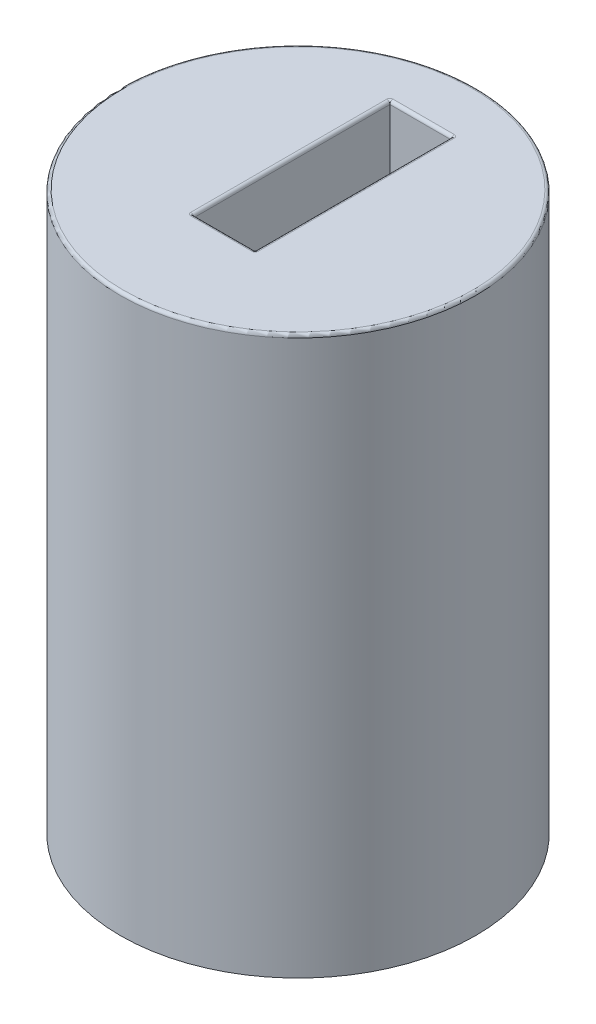
ISO-10303-21;
HEADER;
FILE_DESCRIPTION(('STEP AP214'),'2;1');
FILE_NAME('part.step','',(''),(''),'','','');
FILE_SCHEMA(('AUTOMOTIVE_DESIGN { 1 0 10303 214 1 1 1 1 }'));
ENDSEC;
DATA;
#1=APPLICATION_CONTEXT('core data for automotive mechanical design processes');
#2=APPLICATION_PROTOCOL_DEFINITION('international standard','automotive_design',2000,#1);
#3=PRODUCT_CONTEXT('',#1,'mechanical');
#4=PRODUCT('Part','Part','',(#3));
#5=PRODUCT_RELATED_PRODUCT_CATEGORY('part','',(#4));
#6=PRODUCT_DEFINITION_FORMATION('','',#4);
#7=PRODUCT_DEFINITION_CONTEXT('part definition',#1,'design');
#8=PRODUCT_DEFINITION('design','',#6,#7);
#9=PRODUCT_DEFINITION_SHAPE('','',#8);
#10=(LENGTH_UNIT() NAMED_UNIT(*) SI_UNIT(.MILLI.,.METRE.));
#11=(NAMED_UNIT(*) PLANE_ANGLE_UNIT() SI_UNIT($,.RADIAN.));
#12=(NAMED_UNIT(*) SI_UNIT($,.STERADIAN.) SOLID_ANGLE_UNIT());
#13=UNCERTAINTY_MEASURE_WITH_UNIT(LENGTH_MEASURE(1.E-05),#10,'distance_accuracy_value','');
#14=(GEOMETRIC_REPRESENTATION_CONTEXT(3) GLOBAL_UNCERTAINTY_ASSIGNED_CONTEXT((#13)) GLOBAL_UNIT_ASSIGNED_CONTEXT((#10,
#11,#12)) REPRESENTATION_CONTEXT('',''));
#15=CARTESIAN_POINT('',(0.,0.,0.));
#16=DIRECTION('',(0.,0.,1.));
#17=DIRECTION('',(1.,0.,0.));
#18=AXIS2_PLACEMENT_3D('',#15,#16,#17);
#19=CARTESIAN_POINT('',(0.,34.64,0.));
#20=DIRECTION('',(0.,-1.,0.));
#21=DIRECTION('',(0.,0.,-1.));
#22=AXIS2_PLACEMENT_3D('',#19,#20,#21);
#23=CYLINDRICAL_SURFACE('',#22,7.25);
#24=CARTESIAN_POINT('',(0.,34.513,0.));
#25=DIRECTION('',(0.,1.,0.));
#26=DIRECTION('',(0.,0.,1.));
#27=AXIS2_PLACEMENT_3D('',#24,#25,#26);
#28=CIRCLE('',#27,7.25);
#29=CARTESIAN_POINT('',(0.,34.513,7.25));
#30=VERTEX_POINT('',#29);
#31=EDGE_CURVE('E131',#30,#30,#28,.F.);
#32=ORIENTED_EDGE('',*,*,#31,.T.);
#33=EDGE_LOOP('',(#32));
#34=FACE_BOUND('',#33,.T.);
#35=CARTESIAN_POINT('',(0.,11.9,0.));
#36=DIRECTION('',(0.,-1.,0.));
#37=DIRECTION('',(0.,0.,1.));
#38=AXIS2_PLACEMENT_3D('',#35,#36,#37);
#39=CIRCLE('',#38,7.25);
#40=CARTESIAN_POINT('',(0.,11.9,7.25));
#41=VERTEX_POINT('',#40);
#42=EDGE_CURVE('E126',#41,#41,#39,.T.);
#43=ORIENTED_EDGE('',*,*,#42,.F.);
#44=EDGE_LOOP('',(#43));
#45=FACE_BOUND('',#44,.T.);
#46=ADVANCED_FACE('F35',(#34,#45),#23,.T.);
#47=CARTESIAN_POINT('',(0.,34.64,0.));
#48=DIRECTION('',(0.,1.,0.));
#49=DIRECTION('',(0.,0.,1.));
#50=AXIS2_PLACEMENT_3D('',#47,#48,#49);
#51=PLANE('',#50);
#52=CARTESIAN_POINT('',(0.,34.64,0.));
#53=DIRECTION('',(0.,1.,0.));
#54=DIRECTION('',(0.,0.,1.));
#55=AXIS2_PLACEMENT_3D('',#52,#53,#54);
#56=CIRCLE('',#55,7.123);
#57=CARTESIAN_POINT('',(0.,34.64,7.123));
#58=VERTEX_POINT('',#57);
#59=EDGE_CURVE('E155',#58,#58,#56,.T.);
#60=ORIENTED_EDGE('',*,*,#59,.T.);
#61=EDGE_LOOP('',(#60));
#62=FACE_BOUND('',#61,.T.);
#63=CARTESIAN_POINT('',(1.25,34.64,3.));
#64=DIRECTION('',(0.,1.,0.));
#65=DIRECTION('',(0.,0.,1.));
#66=AXIS2_PLACEMENT_3D('',#63,#64,#65);
#67=CIRCLE('',#66,0.127);
#68=CARTESIAN_POINT('',(1.25,34.64,3.127));
#69=VERTEX_POINT('',#68);
#70=CARTESIAN_POINT('',(1.377,34.64,3.));
#71=VERTEX_POINT('',#70);
#72=EDGE_CURVE('E147',#69,#71,#67,.T.);
#73=ORIENTED_EDGE('',*,*,#72,.F.);
#74=DIRECTION('',(-1.,0.,0.));
#75=VECTOR('',#74,1.);
#76=CARTESIAN_POINT('',(-1.25,34.64,3.127));
#77=LINE('',#76,#75);
#78=CARTESIAN_POINT('',(-1.25,34.64,3.127));
#79=VERTEX_POINT('',#78);
#80=EDGE_CURVE('E153',#69,#79,#77,.T.);
#81=ORIENTED_EDGE('',*,*,#80,.T.);
#82=CARTESIAN_POINT('',(-1.25,34.64,3.));
#83=DIRECTION('',(0.,1.,0.));
#84=DIRECTION('',(0.,0.,1.));
#85=AXIS2_PLACEMENT_3D('',#82,#83,#84);
#86=CIRCLE('',#85,0.127);
#87=CARTESIAN_POINT('',(-1.377,34.64,3.));
#88=VERTEX_POINT('',#87);
#89=EDGE_CURVE('E150',#88,#79,#86,.T.);
#90=ORIENTED_EDGE('',*,*,#89,.F.);
#91=DIRECTION('',(0.,0.,-1.));
#92=VECTOR('',#91,1.);
#93=CARTESIAN_POINT('',(-1.377,34.64,-5.));
#94=LINE('',#93,#92);
#95=CARTESIAN_POINT('',(-1.377,34.64,-5.));
#96=VERTEX_POINT('',#95);
#97=EDGE_CURVE('E144',#88,#96,#94,.T.);
#98=ORIENTED_EDGE('',*,*,#97,.T.);
#99=CARTESIAN_POINT('',(-1.25,34.64,-5.));
#100=DIRECTION('',(0.,1.,0.));
#101=DIRECTION('',(0.,0.,1.));
#102=AXIS2_PLACEMENT_3D('',#99,#100,#101);
#103=CIRCLE('',#102,0.127);
#104=CARTESIAN_POINT('',(-1.25,34.64,-5.127));
#105=VERTEX_POINT('',#104);
#106=EDGE_CURVE('E141',#105,#96,#103,.T.);
#107=ORIENTED_EDGE('',*,*,#106,.F.);
#108=DIRECTION('',(1.,0.,0.));
#109=VECTOR('',#108,1.);
#110=CARTESIAN_POINT('',(1.25,34.64,-5.127));
#111=LINE('',#110,#109);
#112=CARTESIAN_POINT('',(1.25,34.64,-5.127));
#113=VERTEX_POINT('',#112);
#114=EDGE_CURVE('E137',#105,#113,#111,.T.);
#115=ORIENTED_EDGE('',*,*,#114,.T.);
#116=CARTESIAN_POINT('',(1.25,34.64,-5.));
#117=DIRECTION('',(0.,1.,0.));
#118=DIRECTION('',(0.,0.,1.));
#119=AXIS2_PLACEMENT_3D('',#116,#117,#118);
#120=CIRCLE('',#119,0.127);
#121=CARTESIAN_POINT('',(1.377,34.64,-5.));
#122=VERTEX_POINT('',#121);
#123=EDGE_CURVE('E134',#122,#113,#120,.T.);
#124=ORIENTED_EDGE('',*,*,#123,.F.);
#125=DIRECTION('',(0.,0.,1.));
#126=VECTOR('',#125,1.);
#127=CARTESIAN_POINT('',(1.377,34.64,3.));
#128=LINE('',#127,#126);
#129=EDGE_CURVE('E139',#122,#71,#128,.T.);
#130=ORIENTED_EDGE('',*,*,#129,.T.);
#131=EDGE_LOOP('',(#73,#81,#90,#98,#107,#115,#124,#130));
#132=FACE_BOUND('',#131,.T.);
#133=ADVANCED_FACE('F204',(#62,#132),#51,.T.);
#134=CARTESIAN_POINT('',(0.,11.9,0.));
#135=DIRECTION('',(0.,1.,0.));
#136=DIRECTION('',(0.,0.,1.));
#137=AXIS2_PLACEMENT_3D('',#134,#135,#136);
#138=PLANE('',#137);
#139=DIRECTION('',(0.,0.,1.));
#140=VECTOR('',#139,1.);
#141=CARTESIAN_POINT('',(1.25,11.9,3.));
#142=LINE('',#141,#140);
#143=CARTESIAN_POINT('',(1.25,11.9,-5.));
#144=VERTEX_POINT('',#143);
#145=CARTESIAN_POINT('',(1.25,11.9,3.));
#146=VERTEX_POINT('',#145);
#147=EDGE_CURVE('E109',#144,#146,#142,.T.);
#148=ORIENTED_EDGE('',*,*,#147,.F.);
#149=DIRECTION('',(1.,0.,0.));
#150=VECTOR('',#149,1.);
#151=CARTESIAN_POINT('',(1.25,11.9,-5.));
#152=LINE('',#151,#150);
#153=CARTESIAN_POINT('',(-1.25,11.9,-5.));
#154=VERTEX_POINT('',#153);
#155=EDGE_CURVE('E114',#154,#144,#152,.T.);
#156=ORIENTED_EDGE('',*,*,#155,.F.);
#157=DIRECTION('',(0.,0.,-1.));
#158=VECTOR('',#157,1.);
#159=CARTESIAN_POINT('',(-1.25,11.9,-5.));
#160=LINE('',#159,#158);
#161=CARTESIAN_POINT('',(-1.25,11.9,3.));
#162=VERTEX_POINT('',#161);
#163=EDGE_CURVE('E119',#162,#154,#160,.T.);
#164=ORIENTED_EDGE('',*,*,#163,.F.);
#165=DIRECTION('',(-1.,0.,0.));
#166=VECTOR('',#165,1.);
#167=CARTESIAN_POINT('',(-1.25,11.9,3.));
#168=LINE('',#167,#166);
#169=EDGE_CURVE('E103',#146,#162,#168,.T.);
#170=ORIENTED_EDGE('',*,*,#169,.F.);
#171=EDGE_LOOP('',(#148,#156,#164,#170));
#172=FACE_BOUND('',#171,.T.);
#173=ORIENTED_EDGE('',*,*,#42,.T.);
#174=EDGE_LOOP('',(#173));
#175=FACE_BOUND('',#174,.T.);
#176=ADVANCED_FACE('F116',(#172,#175),#138,.F.);
#177=CARTESIAN_POINT('',(1.25,34.64,-5.));
#178=DIRECTION('',(0.,0.,-1.));
#179=DIRECTION('',(-1.,0.,0.));
#180=AXIS2_PLACEMENT_3D('',#177,#178,#179);
#181=PLANE('',#180);
#182=DIRECTION('',(0.,-1.,0.));
#183=VECTOR('',#182,1.);
#184=CARTESIAN_POINT('',(1.25,34.64,-5.));
#185=LINE('',#184,#183);
#186=CARTESIAN_POINT('',(1.25,34.513,-5.));
#187=VERTEX_POINT('',#186);
#188=EDGE_CURVE('E106',#187,#144,#185,.T.);
#189=ORIENTED_EDGE('',*,*,#188,.F.);
#190=DIRECTION('',(1.,0.,0.));
#191=VECTOR('',#190,1.);
#192=CARTESIAN_POINT('',(-1.25,34.513,-5.));
#193=LINE('',#192,#191);
#194=CARTESIAN_POINT('',(-1.25,34.513,-5.));
#195=VERTEX_POINT('',#194);
#196=EDGE_CURVE('E11',#187,#195,#193,.F.);
#197=ORIENTED_EDGE('',*,*,#196,.T.);
#198=DIRECTION('',(0.,-1.,0.));
#199=VECTOR('',#198,1.);
#200=CARTESIAN_POINT('',(-1.25,34.64,-5.));
#201=LINE('',#200,#199);
#202=EDGE_CURVE('E124',#195,#154,#201,.T.);
#203=ORIENTED_EDGE('',*,*,#202,.T.);
#204=ORIENTED_EDGE('',*,*,#155,.T.);
#205=EDGE_LOOP('',(#189,#197,#203,#204));
#206=FACE_BOUND('',#205,.T.);
#207=ADVANCED_FACE('F188',(#206),#181,.F.);
#208=CARTESIAN_POINT('',(-1.25,34.64,-5.));
#209=DIRECTION('',(-1.,0.,0.));
#210=DIRECTION('',(0.,0.,1.));
#211=AXIS2_PLACEMENT_3D('',#208,#209,#210);
#212=PLANE('',#211);
#213=ORIENTED_EDGE('',*,*,#202,.F.);
#214=DIRECTION('',(0.,0.,-1.));
#215=VECTOR('',#214,1.);
#216=CARTESIAN_POINT('',(-1.25,34.513,3.));
#217=LINE('',#216,#215);
#218=CARTESIAN_POINT('',(-1.25,34.513,3.));
#219=VERTEX_POINT('',#218);
#220=EDGE_CURVE('E158',#195,#219,#217,.F.);
#221=ORIENTED_EDGE('',*,*,#220,.T.);
#222=DIRECTION('',(0.,-1.,0.));
#223=VECTOR('',#222,1.);
#224=CARTESIAN_POINT('',(-1.25,34.64,3.));
#225=LINE('',#224,#223);
#226=EDGE_CURVE('E105',#219,#162,#225,.T.);
#227=ORIENTED_EDGE('',*,*,#226,.T.);
#228=ORIENTED_EDGE('',*,*,#163,.T.);
#229=EDGE_LOOP('',(#213,#221,#227,#228));
#230=FACE_BOUND('',#229,.T.);
#231=ADVANCED_FACE('F193',(#230),#212,.F.);
#232=CARTESIAN_POINT('',(-1.25,34.64,3.));
#233=DIRECTION('',(0.,0.,1.));
#234=DIRECTION('',(1.,0.,0.));
#235=AXIS2_PLACEMENT_3D('',#232,#233,#234);
#236=PLANE('',#235);
#237=ORIENTED_EDGE('',*,*,#226,.F.);
#238=DIRECTION('',(-1.,0.,0.));
#239=VECTOR('',#238,1.);
#240=CARTESIAN_POINT('',(1.25,34.513,3.));
#241=LINE('',#240,#239);
#242=CARTESIAN_POINT('',(1.25,34.513,3.));
#243=VERTEX_POINT('',#242);
#244=EDGE_CURVE('E59',#219,#243,#241,.F.);
#245=ORIENTED_EDGE('',*,*,#244,.T.);
#246=DIRECTION('',(0.,-1.,0.));
#247=VECTOR('',#246,1.);
#248=CARTESIAN_POINT('',(1.25,34.64,3.));
#249=LINE('',#248,#247);
#250=EDGE_CURVE('E99',#243,#146,#249,.T.);
#251=ORIENTED_EDGE('',*,*,#250,.T.);
#252=ORIENTED_EDGE('',*,*,#169,.T.);
#253=EDGE_LOOP('',(#237,#245,#251,#252));
#254=FACE_BOUND('',#253,.T.);
#255=ADVANCED_FACE('F101',(#254),#236,.F.);
#256=CARTESIAN_POINT('',(1.25,34.64,3.));
#257=DIRECTION('',(1.,0.,0.));
#258=DIRECTION('',(0.,0.,-1.));
#259=AXIS2_PLACEMENT_3D('',#256,#257,#258);
#260=PLANE('',#259);
#261=ORIENTED_EDGE('',*,*,#250,.F.);
#262=DIRECTION('',(0.,0.,1.));
#263=VECTOR('',#262,1.);
#264=CARTESIAN_POINT('',(1.25,34.513,-5.));
#265=LINE('',#264,#263);
#266=EDGE_CURVE('E44',#243,#187,#265,.F.);
#267=ORIENTED_EDGE('',*,*,#266,.T.);
#268=ORIENTED_EDGE('',*,*,#188,.T.);
#269=ORIENTED_EDGE('',*,*,#147,.T.);
#270=EDGE_LOOP('',(#261,#267,#268,#269));
#271=FACE_BOUND('',#270,.T.);
#272=ADVANCED_FACE('F110',(#271),#260,.F.);
#273=CARTESIAN_POINT('',(0.,34.513,0.));
#274=DIRECTION('',(0.,1.,0.));
#275=DIRECTION('',(0.,0.,1.));
#276=AXIS2_PLACEMENT_3D('',#273,#274,#275);
#277=TOROIDAL_SURFACE('',#276,7.123,0.127);
#278=ORIENTED_EDGE('',*,*,#59,.F.);
#279=EDGE_LOOP('',(#278));
#280=FACE_BOUND('',#279,.T.);
#281=ORIENTED_EDGE('',*,*,#31,.F.);
#282=EDGE_LOOP('',(#281));
#283=FACE_BOUND('',#282,.T.);
#284=ADVANCED_FACE('F236',(#280,#283),#277,.T.);
#285=CARTESIAN_POINT('',(1.377,34.513,0.));
#286=DIRECTION('',(0.,0.,-1.));
#287=DIRECTION('',(-1.,0.,0.));
#288=AXIS2_PLACEMENT_3D('',#285,#286,#287);
#289=CYLINDRICAL_SURFACE('',#288,0.127);
#290=CARTESIAN_POINT('',(1.377,34.513,3.));
#291=DIRECTION('',(0.,0.,1.));
#292=DIRECTION('',(1.,0.,0.));
#293=AXIS2_PLACEMENT_3D('',#290,#291,#292);
#294=CIRCLE('',#293,0.127);
#295=EDGE_CURVE('E39',#71,#243,#294,.T.);
#296=ORIENTED_EDGE('',*,*,#295,.F.);
#297=ORIENTED_EDGE('',*,*,#129,.F.);
#298=CARTESIAN_POINT('',(1.377,34.513,-5.));
#299=DIRECTION('',(0.,0.,-1.));
#300=DIRECTION('',(-1.,0.,0.));
#301=AXIS2_PLACEMENT_3D('',#298,#299,#300);
#302=CIRCLE('',#301,0.127);
#303=EDGE_CURVE('E178',#187,#122,#302,.T.);
#304=ORIENTED_EDGE('',*,*,#303,.F.);
#305=ORIENTED_EDGE('',*,*,#266,.F.);
#306=EDGE_LOOP('',(#296,#297,#304,#305));
#307=FACE_BOUND('',#306,.T.);
#308=ADVANCED_FACE('F37',(#307),#289,.T.);
#309=CARTESIAN_POINT('',(1.25,34.513,3.));
#310=DIRECTION('',(0.,1.,0.));
#311=DIRECTION('',(0.,0.,1.));
#312=AXIS2_PLACEMENT_3D('',#309,#310,#311);
#313=DEGENERATE_TOROIDAL_SURFACE('',#312,0.127,0.127,.T.);
#314=ORIENTED_EDGE('',*,*,#72,.T.);
#315=ORIENTED_EDGE('',*,*,#295,.T.);
#316=CARTESIAN_POINT('',(1.25,34.513,3.127));
#317=DIRECTION('',(1.,0.,0.));
#318=DIRECTION('',(0.,0.,-1.));
#319=AXIS2_PLACEMENT_3D('',#316,#317,#318);
#320=CIRCLE('',#319,0.127);
#321=EDGE_CURVE('E176',#69,#243,#320,.F.);
#322=ORIENTED_EDGE('',*,*,#321,.F.);
#323=EDGE_LOOP('',(#314,#315,#322));
#324=FACE_BOUND('',#323,.T.);
#325=ADVANCED_FACE('F211',(#324),#313,.T.);
#326=CARTESIAN_POINT('',(1.25,34.513,-5.));
#327=DIRECTION('',(0.,1.,0.));
#328=DIRECTION('',(0.,0.,1.));
#329=AXIS2_PLACEMENT_3D('',#326,#327,#328);
#330=DEGENERATE_TOROIDAL_SURFACE('',#329,0.127,0.127,.T.);
#331=ORIENTED_EDGE('',*,*,#303,.T.);
#332=ORIENTED_EDGE('',*,*,#123,.T.);
#333=CARTESIAN_POINT('',(1.25,34.513,-5.127));
#334=DIRECTION('',(1.,0.,0.));
#335=DIRECTION('',(0.,0.,-1.));
#336=AXIS2_PLACEMENT_3D('',#333,#334,#335);
#337=CIRCLE('',#336,0.127);
#338=EDGE_CURVE('E173',#187,#113,#337,.F.);
#339=ORIENTED_EDGE('',*,*,#338,.F.);
#340=EDGE_LOOP('',(#331,#332,#339));
#341=FACE_BOUND('',#340,.T.);
#342=ADVANCED_FACE('F214',(#341),#330,.T.);
#343=CARTESIAN_POINT('',(0.,34.513,3.127));
#344=DIRECTION('',(1.,0.,0.));
#345=DIRECTION('',(0.,0.,-1.));
#346=AXIS2_PLACEMENT_3D('',#343,#344,#345);
#347=CYLINDRICAL_SURFACE('',#346,0.127);
#348=ORIENTED_EDGE('',*,*,#321,.T.);
#349=ORIENTED_EDGE('',*,*,#244,.F.);
#350=CARTESIAN_POINT('',(-1.25,34.513,3.127));
#351=DIRECTION('',(-1.,0.,0.));
#352=DIRECTION('',(0.,0.,1.));
#353=AXIS2_PLACEMENT_3D('',#350,#351,#352);
#354=CIRCLE('',#353,0.127);
#355=EDGE_CURVE('E170',#79,#219,#354,.T.);
#356=ORIENTED_EDGE('',*,*,#355,.F.);
#357=ORIENTED_EDGE('',*,*,#80,.F.);
#358=EDGE_LOOP('',(#348,#349,#356,#357));
#359=FACE_BOUND('',#358,.T.);
#360=ADVANCED_FACE('F210',(#359),#347,.T.);
#361=CARTESIAN_POINT('',(0.,34.513,-5.127));
#362=DIRECTION('',(-1.,0.,0.));
#363=DIRECTION('',(0.,0.,1.));
#364=AXIS2_PLACEMENT_3D('',#361,#362,#363);
#365=CYLINDRICAL_SURFACE('',#364,0.127);
#366=ORIENTED_EDGE('',*,*,#338,.T.);
#367=ORIENTED_EDGE('',*,*,#114,.F.);
#368=CARTESIAN_POINT('',(-1.25,34.513,-5.127));
#369=DIRECTION('',(-1.,0.,0.));
#370=DIRECTION('',(0.,0.,1.));
#371=AXIS2_PLACEMENT_3D('',#368,#369,#370);
#372=CIRCLE('',#371,0.127);
#373=EDGE_CURVE('E167',#195,#105,#372,.T.);
#374=ORIENTED_EDGE('',*,*,#373,.F.);
#375=ORIENTED_EDGE('',*,*,#196,.F.);
#376=EDGE_LOOP('',(#366,#367,#374,#375));
#377=FACE_BOUND('',#376,.T.);
#378=ADVANCED_FACE('F216',(#377),#365,.T.);
#379=CARTESIAN_POINT('',(-1.25,34.513,3.));
#380=DIRECTION('',(0.,1.,0.));
#381=DIRECTION('',(0.,0.,1.));
#382=AXIS2_PLACEMENT_3D('',#379,#380,#381);
#383=DEGENERATE_TOROIDAL_SURFACE('',#382,0.127,0.127,.T.);
#384=ORIENTED_EDGE('',*,*,#89,.T.);
#385=ORIENTED_EDGE('',*,*,#355,.T.);
#386=CARTESIAN_POINT('',(-1.377,34.513,3.));
#387=DIRECTION('',(0.,0.,1.));
#388=DIRECTION('',(1.,0.,0.));
#389=AXIS2_PLACEMENT_3D('',#386,#387,#388);
#390=CIRCLE('',#389,0.127);
#391=EDGE_CURVE('E165',#88,#219,#390,.F.);
#392=ORIENTED_EDGE('',*,*,#391,.F.);
#393=EDGE_LOOP('',(#384,#385,#392));
#394=FACE_BOUND('',#393,.T.);
#395=ADVANCED_FACE('F208',(#394),#383,.T.);
#396=CARTESIAN_POINT('',(-1.25,34.513,-5.));
#397=DIRECTION('',(0.,1.,0.));
#398=DIRECTION('',(0.,0.,1.));
#399=AXIS2_PLACEMENT_3D('',#396,#397,#398);
#400=DEGENERATE_TOROIDAL_SURFACE('',#399,0.127,0.127,.T.);
#401=ORIENTED_EDGE('',*,*,#373,.T.);
#402=ORIENTED_EDGE('',*,*,#106,.T.);
#403=CARTESIAN_POINT('',(-1.377,34.513,-5.));
#404=DIRECTION('',(0.,0.,-1.));
#405=DIRECTION('',(-1.,0.,0.));
#406=AXIS2_PLACEMENT_3D('',#403,#404,#405);
#407=CIRCLE('',#406,0.127);
#408=EDGE_CURVE('E163',#195,#96,#407,.F.);
#409=ORIENTED_EDGE('',*,*,#408,.F.);
#410=EDGE_LOOP('',(#401,#402,#409));
#411=FACE_BOUND('',#410,.T.);
#412=ADVANCED_FACE('F201',(#411),#400,.T.);
#413=CARTESIAN_POINT('',(-1.377,34.513,0.));
#414=DIRECTION('',(0.,0.,1.));
#415=DIRECTION('',(1.,0.,0.));
#416=AXIS2_PLACEMENT_3D('',#413,#414,#415);
#417=CYLINDRICAL_SURFACE('',#416,0.127);
#418=ORIENTED_EDGE('',*,*,#391,.T.);
#419=ORIENTED_EDGE('',*,*,#220,.F.);
#420=ORIENTED_EDGE('',*,*,#408,.T.);
#421=ORIENTED_EDGE('',*,*,#97,.F.);
#422=EDGE_LOOP('',(#418,#419,#420,#421));
#423=FACE_BOUND('',#422,.T.);
#424=ADVANCED_FACE('F197',(#423),#417,.T.);
#425=CLOSED_SHELL('',(#46,#133,#176,#207,#231,#255,#272,#284,#308,#325,#342,#360,#378,#395,#412,#424));
#426=MANIFOLD_SOLID_BREP('B2',#425);
#427=ADVANCED_BREP_SHAPE_REPRESENTATION('',(#18,#426),#14);
#428=SHAPE_DEFINITION_REPRESENTATION(#9,#427);
ENDSEC;
END-ISO-10303-21;
